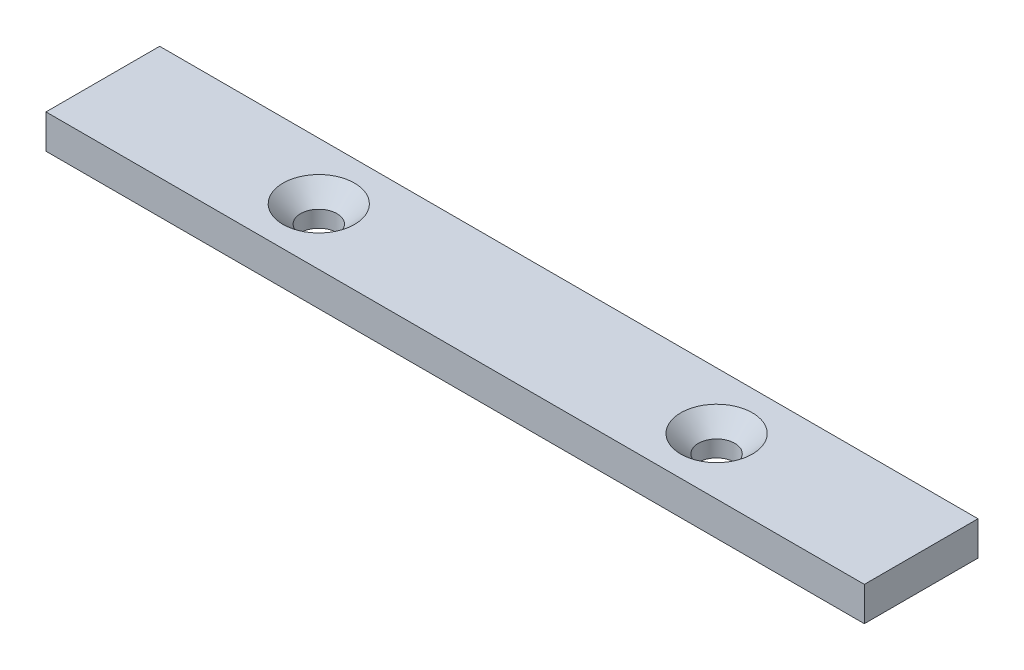
ISO-10303-21;
HEADER;
FILE_DESCRIPTION(('STEP AP214'),'2;1');
FILE_NAME('part.step','',(''),(''),'','','');
FILE_SCHEMA(('AUTOMOTIVE_DESIGN { 1 0 10303 214 1 1 1 1 }'));
ENDSEC;
DATA;
#1=APPLICATION_CONTEXT('core data for automotive mechanical design processes');
#2=APPLICATION_PROTOCOL_DEFINITION('international standard','automotive_design',2000,#1);
#3=PRODUCT_CONTEXT('',#1,'mechanical');
#4=PRODUCT('Part','Part','',(#3));
#5=PRODUCT_RELATED_PRODUCT_CATEGORY('part','',(#4));
#6=PRODUCT_DEFINITION_FORMATION('','',#4);
#7=PRODUCT_DEFINITION_CONTEXT('part definition',#1,'design');
#8=PRODUCT_DEFINITION('design','',#6,#7);
#9=PRODUCT_DEFINITION_SHAPE('','',#8);
#10=(LENGTH_UNIT() NAMED_UNIT(*) SI_UNIT(.MILLI.,.METRE.));
#11=(NAMED_UNIT(*) PLANE_ANGLE_UNIT() SI_UNIT($,.RADIAN.));
#12=(NAMED_UNIT(*) SI_UNIT($,.STERADIAN.) SOLID_ANGLE_UNIT());
#13=UNCERTAINTY_MEASURE_WITH_UNIT(LENGTH_MEASURE(1.E-05),#10,'distance_accuracy_value','');
#14=(GEOMETRIC_REPRESENTATION_CONTEXT(3) GLOBAL_UNCERTAINTY_ASSIGNED_CONTEXT((#13)) GLOBAL_UNIT_ASSIGNED_CONTEXT((#10,
#11,#12)) REPRESENTATION_CONTEXT('',''));
#15=CARTESIAN_POINT('',(0.,0.,0.));
#16=DIRECTION('',(0.,0.,1.));
#17=DIRECTION('',(1.,0.,0.));
#18=AXIS2_PLACEMENT_3D('',#15,#16,#17);
#19=CARTESIAN_POINT('',(0.,6.,0.));
#20=DIRECTION('',(0.,-1.,0.));
#21=DIRECTION('',(0.,0.,-1.));
#22=AXIS2_PLACEMENT_3D('',#19,#20,#21);
#23=PLANE('',#22);
#24=DIRECTION('',(0.,0.,-1.));
#25=VECTOR('',#24,1.);
#26=CARTESIAN_POINT('',(72.,6.,10.));
#27=LINE('',#26,#25);
#28=CARTESIAN_POINT('',(72.,6.,10.));
#29=VERTEX_POINT('',#28);
#30=CARTESIAN_POINT('',(72.,6.,-10.));
#31=VERTEX_POINT('',#30);
#32=EDGE_CURVE('E92',#29,#31,#27,.T.);
#33=ORIENTED_EDGE('',*,*,#32,.T.);
#34=DIRECTION('',(-1.,0.,0.));
#35=VECTOR('',#34,1.);
#36=CARTESIAN_POINT('',(-72.,6.,-10.));
#37=LINE('',#36,#35);
#38=CARTESIAN_POINT('',(-72.,6.,-10.));
#39=VERTEX_POINT('',#38);
#40=EDGE_CURVE('E87',#31,#39,#37,.T.);
#41=ORIENTED_EDGE('',*,*,#40,.T.);
#42=DIRECTION('',(0.,0.,1.));
#43=VECTOR('',#42,1.);
#44=CARTESIAN_POINT('',(-72.,6.,10.));
#45=LINE('',#44,#43);
#46=CARTESIAN_POINT('',(-72.,6.,10.));
#47=VERTEX_POINT('',#46);
#48=EDGE_CURVE('E90',#39,#47,#45,.T.);
#49=ORIENTED_EDGE('',*,*,#48,.T.);
#50=DIRECTION('',(1.,0.,0.));
#51=VECTOR('',#50,1.);
#52=CARTESIAN_POINT('',(-72.,6.,10.));
#53=LINE('',#52,#51);
#54=EDGE_CURVE('E57',#47,#29,#53,.T.);
#55=ORIENTED_EDGE('',*,*,#54,.T.);
#56=EDGE_LOOP('',(#33,#41,#49,#55));
#57=FACE_BOUND('',#56,.T.);
#58=CARTESIAN_POINT('',(36.,6.,0.));
#59=DIRECTION('',(0.,1.,0.));
#60=DIRECTION('',(0.,0.,1.));
#61=AXIS2_PLACEMENT_3D('',#58,#59,#60);
#62=CIRCLE('',#61,6.3);
#63=CARTESIAN_POINT('',(36.,6.,6.3));
#64=VERTEX_POINT('',#63);
#65=EDGE_CURVE('E123',#64,#64,#62,.T.);
#66=ORIENTED_EDGE('',*,*,#65,.F.);
#67=EDGE_LOOP('',(#66));
#68=FACE_BOUND('',#67,.T.);
#69=CARTESIAN_POINT('',(-34.,6.,0.));
#70=DIRECTION('',(0.,1.,0.));
#71=DIRECTION('',(0.,0.,1.));
#72=AXIS2_PLACEMENT_3D('',#69,#70,#71);
#73=CIRCLE('',#72,6.3);
#74=CARTESIAN_POINT('',(-34.,6.,6.3));
#75=VERTEX_POINT('',#74);
#76=EDGE_CURVE('E132',#75,#75,#73,.T.);
#77=ORIENTED_EDGE('',*,*,#76,.F.);
#78=EDGE_LOOP('',(#77));
#79=FACE_BOUND('',#78,.T.);
#80=ADVANCED_FACE('F40',(#57,#68,#79),#23,.F.);
#81=CARTESIAN_POINT('',(72.,6.,10.));
#82=DIRECTION('',(-1.,0.,0.));
#83=DIRECTION('',(0.,0.,1.));
#84=AXIS2_PLACEMENT_3D('',#81,#82,#83);
#85=PLANE('',#84);
#86=DIRECTION('',(0.,0.,-1.));
#87=VECTOR('',#86,1.);
#88=CARTESIAN_POINT('',(72.,0.,10.));
#89=LINE('',#88,#87);
#90=CARTESIAN_POINT('',(72.,0.,10.));
#91=VERTEX_POINT('',#90);
#92=CARTESIAN_POINT('',(72.,0.,-10.));
#93=VERTEX_POINT('',#92);
#94=EDGE_CURVE('E104',#91,#93,#89,.T.);
#95=ORIENTED_EDGE('',*,*,#94,.T.);
#96=DIRECTION('',(0.,-1.,0.));
#97=VECTOR('',#96,1.);
#98=CARTESIAN_POINT('',(72.,6.,-10.));
#99=LINE('',#98,#97);
#100=EDGE_CURVE('E11',#31,#93,#99,.T.);
#101=ORIENTED_EDGE('',*,*,#100,.F.);
#102=ORIENTED_EDGE('',*,*,#32,.F.);
#103=DIRECTION('',(0.,-1.,0.));
#104=VECTOR('',#103,1.);
#105=CARTESIAN_POINT('',(72.,6.,10.));
#106=LINE('',#105,#104);
#107=EDGE_CURVE('E100',#29,#91,#106,.T.);
#108=ORIENTED_EDGE('',*,*,#107,.T.);
#109=EDGE_LOOP('',(#95,#101,#102,#108));
#110=FACE_BOUND('',#109,.T.);
#111=ADVANCED_FACE('F42',(#110),#85,.F.);
#112=CARTESIAN_POINT('',(-72.,6.,-10.));
#113=DIRECTION('',(0.,0.,1.));
#114=DIRECTION('',(1.,0.,0.));
#115=AXIS2_PLACEMENT_3D('',#112,#113,#114);
#116=PLANE('',#115);
#117=DIRECTION('',(-1.,0.,0.));
#118=VECTOR('',#117,1.);
#119=CARTESIAN_POINT('',(-72.,0.,-10.));
#120=LINE('',#119,#118);
#121=CARTESIAN_POINT('',(-72.,0.,-10.));
#122=VERTEX_POINT('',#121);
#123=EDGE_CURVE('E96',#93,#122,#120,.T.);
#124=ORIENTED_EDGE('',*,*,#123,.T.);
#125=DIRECTION('',(0.,-1.,0.));
#126=VECTOR('',#125,1.);
#127=CARTESIAN_POINT('',(-72.,6.,-10.));
#128=LINE('',#127,#126);
#129=EDGE_CURVE('E49',#39,#122,#128,.T.);
#130=ORIENTED_EDGE('',*,*,#129,.F.);
#131=ORIENTED_EDGE('',*,*,#40,.F.);
#132=ORIENTED_EDGE('',*,*,#100,.T.);
#133=EDGE_LOOP('',(#124,#130,#131,#132));
#134=FACE_BOUND('',#133,.T.);
#135=ADVANCED_FACE('F95',(#134),#116,.F.);
#136=CARTESIAN_POINT('',(-72.,6.,10.));
#137=DIRECTION('',(1.,0.,0.));
#138=DIRECTION('',(0.,0.,-1.));
#139=AXIS2_PLACEMENT_3D('',#136,#137,#138);
#140=PLANE('',#139);
#141=DIRECTION('',(0.,0.,1.));
#142=VECTOR('',#141,1.);
#143=CARTESIAN_POINT('',(-72.,0.,10.));
#144=LINE('',#143,#142);
#145=CARTESIAN_POINT('',(-72.,0.,10.));
#146=VERTEX_POINT('',#145);
#147=EDGE_CURVE('E74',#122,#146,#144,.T.);
#148=ORIENTED_EDGE('',*,*,#147,.T.);
#149=DIRECTION('',(0.,-1.,0.));
#150=VECTOR('',#149,1.);
#151=CARTESIAN_POINT('',(-72.,6.,10.));
#152=LINE('',#151,#150);
#153=EDGE_CURVE('E97',#47,#146,#152,.T.);
#154=ORIENTED_EDGE('',*,*,#153,.F.);
#155=ORIENTED_EDGE('',*,*,#48,.F.);
#156=ORIENTED_EDGE('',*,*,#129,.T.);
#157=EDGE_LOOP('',(#148,#154,#155,#156));
#158=FACE_BOUND('',#157,.T.);
#159=ADVANCED_FACE('F98',(#158),#140,.F.);
#160=CARTESIAN_POINT('',(-72.,6.,10.));
#161=DIRECTION('',(0.,0.,-1.));
#162=DIRECTION('',(-1.,0.,0.));
#163=AXIS2_PLACEMENT_3D('',#160,#161,#162);
#164=PLANE('',#163);
#165=DIRECTION('',(1.,0.,0.));
#166=VECTOR('',#165,1.);
#167=CARTESIAN_POINT('',(-72.,0.,10.));
#168=LINE('',#167,#166);
#169=EDGE_CURVE('E80',#146,#91,#168,.T.);
#170=ORIENTED_EDGE('',*,*,#169,.T.);
#171=ORIENTED_EDGE('',*,*,#107,.F.);
#172=ORIENTED_EDGE('',*,*,#54,.F.);
#173=ORIENTED_EDGE('',*,*,#153,.T.);
#174=EDGE_LOOP('',(#170,#171,#172,#173));
#175=FACE_BOUND('',#174,.T.);
#176=ADVANCED_FACE('F112',(#175),#164,.F.);
#177=CARTESIAN_POINT('',(0.,0.,0.));
#178=DIRECTION('',(0.,-1.,0.));
#179=DIRECTION('',(0.,0.,-1.));
#180=AXIS2_PLACEMENT_3D('',#177,#178,#179);
#181=PLANE('',#180);
#182=CARTESIAN_POINT('',(-34.,0.,0.));
#183=DIRECTION('',(0.,-1.,0.));
#184=DIRECTION('',(0.,0.,-1.));
#185=AXIS2_PLACEMENT_3D('',#182,#183,#184);
#186=CIRCLE('',#185,3.19999999999999);
#187=CARTESIAN_POINT('',(-34.,0.,-3.19999999999999));
#188=VERTEX_POINT('',#187);
#189=EDGE_CURVE('E126',#188,#188,#186,.T.);
#190=ORIENTED_EDGE('',*,*,#189,.F.);
#191=EDGE_LOOP('',(#190));
#192=FACE_BOUND('',#191,.T.);
#193=CARTESIAN_POINT('',(36.,0.,0.));
#194=DIRECTION('',(0.,-1.,0.));
#195=DIRECTION('',(0.,0.,-1.));
#196=AXIS2_PLACEMENT_3D('',#193,#194,#195);
#197=CIRCLE('',#196,3.19999999999999);
#198=CARTESIAN_POINT('',(36.,0.,-3.19999999999999));
#199=VERTEX_POINT('',#198);
#200=EDGE_CURVE('E107',#199,#199,#197,.T.);
#201=ORIENTED_EDGE('',*,*,#200,.F.);
#202=EDGE_LOOP('',(#201));
#203=FACE_BOUND('',#202,.T.);
#204=ORIENTED_EDGE('',*,*,#94,.F.);
#205=ORIENTED_EDGE('',*,*,#169,.F.);
#206=ORIENTED_EDGE('',*,*,#147,.F.);
#207=ORIENTED_EDGE('',*,*,#123,.F.);
#208=EDGE_LOOP('',(#204,#205,#206,#207));
#209=FACE_BOUND('',#208,.T.);
#210=ADVANCED_FACE('F115',(#192,#203,#209),#181,.T.);
#211=CARTESIAN_POINT('',(36.,6.,0.));
#212=DIRECTION('',(0.,1.,0.));
#213=DIRECTION('',(0.,0.,1.));
#214=AXIS2_PLACEMENT_3D('',#211,#212,#213);
#215=CYLINDRICAL_SURFACE('',#214,3.19999999999999);
#216=CARTESIAN_POINT('',(36.,2.89999999999999,0.));
#217=DIRECTION('',(0.,1.,0.));
#218=DIRECTION('',(0.,0.,1.));
#219=AXIS2_PLACEMENT_3D('',#216,#217,#218);
#220=CIRCLE('',#219,3.19999999999999);
#221=CARTESIAN_POINT('',(36.,2.89999999999999,3.19999999999999));
#222=VERTEX_POINT('',#221);
#223=EDGE_CURVE('E120',#222,#222,#220,.T.);
#224=ORIENTED_EDGE('',*,*,#223,.T.);
#225=EDGE_LOOP('',(#224));
#226=FACE_BOUND('',#225,.T.);
#227=ORIENTED_EDGE('',*,*,#200,.T.);
#228=EDGE_LOOP('',(#227));
#229=FACE_BOUND('',#228,.T.);
#230=ADVANCED_FACE('F145',(#226,#229),#215,.F.);
#231=CARTESIAN_POINT('',(36.,6.,0.));
#232=DIRECTION('',(0.,1.,0.));
#233=DIRECTION('',(0.,0.,1.));
#234=AXIS2_PLACEMENT_3D('',#231,#232,#233);
#235=CONICAL_SURFACE('',#234,6.3,0.785398163397449);
#236=ORIENTED_EDGE('',*,*,#223,.F.);
#237=EDGE_LOOP('',(#236));
#238=FACE_BOUND('',#237,.T.);
#239=ORIENTED_EDGE('',*,*,#65,.T.);
#240=EDGE_LOOP('',(#239));
#241=FACE_BOUND('',#240,.T.);
#242=ADVANCED_FACE('F176',(#238,#241),#235,.F.);
#243=CARTESIAN_POINT('',(-34.,6.,0.));
#244=DIRECTION('',(0.,1.,0.));
#245=DIRECTION('',(0.,0.,1.));
#246=AXIS2_PLACEMENT_3D('',#243,#244,#245);
#247=CYLINDRICAL_SURFACE('',#246,3.19999999999999);
#248=CARTESIAN_POINT('',(-34.,2.89999999999999,0.));
#249=DIRECTION('',(0.,1.,0.));
#250=DIRECTION('',(0.,0.,1.));
#251=AXIS2_PLACEMENT_3D('',#248,#249,#250);
#252=CIRCLE('',#251,3.19999999999999);
#253=CARTESIAN_POINT('',(-34.,2.89999999999999,3.19999999999999));
#254=VERTEX_POINT('',#253);
#255=EDGE_CURVE('E129',#254,#254,#252,.T.);
#256=ORIENTED_EDGE('',*,*,#255,.T.);
#257=EDGE_LOOP('',(#256));
#258=FACE_BOUND('',#257,.T.);
#259=ORIENTED_EDGE('',*,*,#189,.T.);
#260=EDGE_LOOP('',(#259));
#261=FACE_BOUND('',#260,.T.);
#262=ADVANCED_FACE('F183',(#258,#261),#247,.F.);
#263=CARTESIAN_POINT('',(-34.,6.,0.));
#264=DIRECTION('',(0.,1.,0.));
#265=DIRECTION('',(0.,0.,1.));
#266=AXIS2_PLACEMENT_3D('',#263,#264,#265);
#267=CONICAL_SURFACE('',#266,6.3,0.785398163397449);
#268=ORIENTED_EDGE('',*,*,#255,.F.);
#269=EDGE_LOOP('',(#268));
#270=FACE_BOUND('',#269,.T.);
#271=ORIENTED_EDGE('',*,*,#76,.T.);
#272=EDGE_LOOP('',(#271));
#273=FACE_BOUND('',#272,.T.);
#274=ADVANCED_FACE('F136',(#270,#273),#267,.F.);
#275=CLOSED_SHELL('',(#80,#111,#135,#159,#176,#210,#230,#242,#262,#274));
#276=MANIFOLD_SOLID_BREP('B2',#275);
#277=ADVANCED_BREP_SHAPE_REPRESENTATION('',(#18,#276),#14);
#278=SHAPE_DEFINITION_REPRESENTATION(#9,#277);
ENDSEC;
END-ISO-10303-21;
